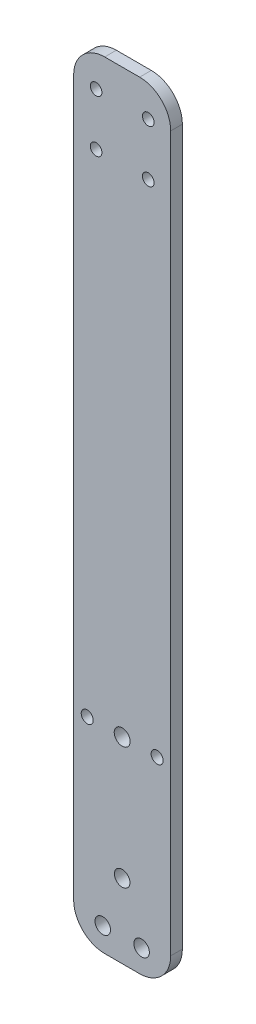
ISO-10303-21;
HEADER;
FILE_DESCRIPTION(('STEP AP214'),'2;1');
FILE_NAME('part.step','',(''),(''),'','','');
FILE_SCHEMA(('AUTOMOTIVE_DESIGN { 1 0 10303 214 1 1 1 1 }'));
ENDSEC;
DATA;
#1=APPLICATION_CONTEXT('core data for automotive mechanical design processes');
#2=APPLICATION_PROTOCOL_DEFINITION('international standard','automotive_design',2000,#1);
#3=PRODUCT_CONTEXT('',#1,'mechanical');
#4=PRODUCT('Part','Part','',(#3));
#5=PRODUCT_RELATED_PRODUCT_CATEGORY('part','',(#4));
#6=PRODUCT_DEFINITION_FORMATION('','',#4);
#7=PRODUCT_DEFINITION_CONTEXT('part definition',#1,'design');
#8=PRODUCT_DEFINITION('design','',#6,#7);
#9=PRODUCT_DEFINITION_SHAPE('','',#8);
#10=(LENGTH_UNIT() NAMED_UNIT(*) SI_UNIT(.MILLI.,.METRE.));
#11=(NAMED_UNIT(*) PLANE_ANGLE_UNIT() SI_UNIT($,.RADIAN.));
#12=(NAMED_UNIT(*) SI_UNIT($,.STERADIAN.) SOLID_ANGLE_UNIT());
#13=UNCERTAINTY_MEASURE_WITH_UNIT(LENGTH_MEASURE(1.E-05),#10,'distance_accuracy_value','');
#14=(GEOMETRIC_REPRESENTATION_CONTEXT(3) GLOBAL_UNCERTAINTY_ASSIGNED_CONTEXT((#13)) GLOBAL_UNIT_ASSIGNED_CONTEXT((#10,
#11,#12)) REPRESENTATION_CONTEXT('',''));
#15=CARTESIAN_POINT('',(0.,0.,0.));
#16=DIRECTION('',(0.,0.,1.));
#17=DIRECTION('',(1.,0.,0.));
#18=AXIS2_PLACEMENT_3D('',#15,#16,#17);
#19=CARTESIAN_POINT('',(0.,0.,3.));
#20=DIRECTION('',(0.,0.,-1.));
#21=DIRECTION('',(-1.,0.,0.));
#22=AXIS2_PLACEMENT_3D('',#19,#20,#21);
#23=PLANE('',#22);
#24=CARTESIAN_POINT('',(21.5,50.5628276457725,3.));
#25=DIRECTION('',(0.,0.,1.));
#26=DIRECTION('',(1.,0.,0.));
#27=AXIS2_PLACEMENT_3D('',#24,#25,#26);
#28=CIRCLE('',#27,1.55);
#29=CARTESIAN_POINT('',(23.05,50.5628276457725,3.));
#30=VERTEX_POINT('',#29);
#31=EDGE_CURVE('E229',#30,#30,#28,.T.);
#32=ORIENTED_EDGE('',*,*,#31,.F.);
#33=EDGE_LOOP('',(#32));
#34=FACE_BOUND('',#33,.T.);
#35=CARTESIAN_POINT('',(3.5,50.5628276457725,3.));
#36=DIRECTION('',(0.,0.,1.));
#37=DIRECTION('',(-1.,0.,0.));
#38=AXIS2_PLACEMENT_3D('',#35,#36,#37);
#39=CIRCLE('',#38,1.55000000000001);
#40=CARTESIAN_POINT('',(5.05000000000001,50.5628276457725,3.));
#41=VERTEX_POINT('',#40);
#42=EDGE_CURVE('E232',#41,#41,#39,.T.);
#43=ORIENTED_EDGE('',*,*,#42,.F.);
#44=EDGE_LOOP('',(#43));
#45=FACE_BOUND('',#44,.T.);
#46=DIRECTION('',(1.,0.,0.));
#47=VECTOR('',#46,1.);
#48=CARTESIAN_POINT('',(0.,0.,3.));
#49=LINE('',#48,#47);
#50=CARTESIAN_POINT('',(8.,0.,3.));
#51=VERTEX_POINT('',#50);
#52=CARTESIAN_POINT('',(17.,0.,3.));
#53=VERTEX_POINT('',#52);
#54=EDGE_CURVE('E174',#51,#53,#49,.T.);
#55=ORIENTED_EDGE('',*,*,#54,.T.);
#56=CARTESIAN_POINT('',(17.,8.,3.));
#57=DIRECTION('',(0.,0.,-1.));
#58=DIRECTION('',(-1.,0.,0.));
#59=AXIS2_PLACEMENT_3D('',#56,#57,#58);
#60=CIRCLE('',#59,8.);
#61=CARTESIAN_POINT('',(25.,8.,3.));
#62=VERTEX_POINT('',#61);
#63=EDGE_CURVE('E152',#53,#62,#60,.F.);
#64=ORIENTED_EDGE('',*,*,#63,.T.);
#65=DIRECTION('',(0.,1.,0.));
#66=VECTOR('',#65,1.);
#67=CARTESIAN_POINT('',(25.,0.,3.));
#68=LINE('',#67,#66);
#69=CARTESIAN_POINT('',(25.,192.,3.));
#70=VERTEX_POINT('',#69);
#71=EDGE_CURVE('E122',#62,#70,#68,.T.);
#72=ORIENTED_EDGE('',*,*,#71,.T.);
#73=CARTESIAN_POINT('',(17.,192.,3.));
#74=DIRECTION('',(0.,0.,-1.));
#75=DIRECTION('',(-1.,0.,0.));
#76=AXIS2_PLACEMENT_3D('',#73,#74,#75);
#77=CIRCLE('',#76,8.);
#78=CARTESIAN_POINT('',(17.,200.,3.));
#79=VERTEX_POINT('',#78);
#80=EDGE_CURVE('E58',#70,#79,#77,.F.);
#81=ORIENTED_EDGE('',*,*,#80,.T.);
#82=DIRECTION('',(-1.,0.,0.));
#83=VECTOR('',#82,1.);
#84=CARTESIAN_POINT('',(0.,200.,3.));
#85=LINE('',#84,#83);
#86=CARTESIAN_POINT('',(8.,200.,3.));
#87=VERTEX_POINT('',#86);
#88=EDGE_CURVE('E138',#79,#87,#85,.T.);
#89=ORIENTED_EDGE('',*,*,#88,.T.);
#90=CARTESIAN_POINT('',(8.,192.,3.));
#91=DIRECTION('',(0.,0.,-1.));
#92=DIRECTION('',(-1.,0.,0.));
#93=AXIS2_PLACEMENT_3D('',#90,#91,#92);
#94=CIRCLE('',#93,8.);
#95=CARTESIAN_POINT('',(0.,192.,3.));
#96=VERTEX_POINT('',#95);
#97=EDGE_CURVE('E148',#87,#96,#94,.F.);
#98=ORIENTED_EDGE('',*,*,#97,.T.);
#99=DIRECTION('',(0.,-1.,0.));
#100=VECTOR('',#99,1.);
#101=CARTESIAN_POINT('',(0.,0.,3.));
#102=LINE('',#101,#100);
#103=CARTESIAN_POINT('',(0.,8.,3.));
#104=VERTEX_POINT('',#103);
#105=EDGE_CURVE('E132',#96,#104,#102,.T.);
#106=ORIENTED_EDGE('',*,*,#105,.T.);
#107=CARTESIAN_POINT('',(8.,8.,3.));
#108=DIRECTION('',(0.,0.,-1.));
#109=DIRECTION('',(-1.,0.,0.));
#110=AXIS2_PLACEMENT_3D('',#107,#108,#109);
#111=CIRCLE('',#110,8.);
#112=EDGE_CURVE('E150',#104,#51,#111,.F.);
#113=ORIENTED_EDGE('',*,*,#112,.T.);
#114=EDGE_LOOP('',(#55,#64,#72,#81,#89,#98,#106,#113));
#115=FACE_BOUND('',#114,.T.);
#116=CARTESIAN_POINT('',(7.5,6.,3.));
#117=DIRECTION('',(0.,0.,1.));
#118=DIRECTION('',(1.,0.,0.));
#119=AXIS2_PLACEMENT_3D('',#116,#117,#118);
#120=CIRCLE('',#119,2.);
#121=CARTESIAN_POINT('',(9.5,6.,3.));
#122=VERTEX_POINT('',#121);
#123=EDGE_CURVE('E183',#122,#122,#120,.T.);
#124=ORIENTED_EDGE('',*,*,#123,.F.);
#125=EDGE_LOOP('',(#124));
#126=FACE_BOUND('',#125,.T.);
#127=CARTESIAN_POINT('',(17.5,6.,3.));
#128=DIRECTION('',(0.,0.,1.));
#129=DIRECTION('',(-1.,0.,0.));
#130=AXIS2_PLACEMENT_3D('',#127,#128,#129);
#131=CIRCLE('',#130,2.);
#132=CARTESIAN_POINT('',(15.5,6.,3.));
#133=VERTEX_POINT('',#132);
#134=EDGE_CURVE('E188',#133,#133,#131,.T.);
#135=ORIENTED_EDGE('',*,*,#134,.F.);
#136=EDGE_LOOP('',(#135));
#137=FACE_BOUND('',#136,.T.);
#138=CARTESIAN_POINT('',(12.5,19.0552824557725,3.));
#139=DIRECTION('',(0.,0.,1.));
#140=DIRECTION('',(1.,0.,0.));
#141=AXIS2_PLACEMENT_3D('',#138,#139,#140);
#142=CIRCLE('',#141,2.);
#143=CARTESIAN_POINT('',(14.5,19.0552824557725,3.));
#144=VERTEX_POINT('',#143);
#145=EDGE_CURVE('E193',#144,#144,#142,.T.);
#146=ORIENTED_EDGE('',*,*,#145,.F.);
#147=EDGE_LOOP('',(#146));
#148=FACE_BOUND('',#147,.T.);
#149=CARTESIAN_POINT('',(5.78248557872782,178.282485578728,3.));
#150=DIRECTION('',(0.,0.,1.));
#151=DIRECTION('',(1.,0.,0.));
#152=AXIS2_PLACEMENT_3D('',#149,#150,#151);
#153=CIRCLE('',#152,1.50000000000003);
#154=CARTESIAN_POINT('',(7.28248557872785,178.282485578728,3.));
#155=VERTEX_POINT('',#154);
#156=EDGE_CURVE('E199',#155,#155,#153,.T.);
#157=ORIENTED_EDGE('',*,*,#156,.F.);
#158=EDGE_LOOP('',(#157));
#159=FACE_BOUND('',#158,.T.);
#160=CARTESIAN_POINT('',(5.78248557872782,191.717514421272,3.));
#161=DIRECTION('',(0.,0.,1.));
#162=DIRECTION('',(1.,0.,0.));
#163=AXIS2_PLACEMENT_3D('',#160,#161,#162);
#164=CIRCLE('',#163,1.5);
#165=CARTESIAN_POINT('',(7.28248557872782,191.717514421272,3.));
#166=VERTEX_POINT('',#165);
#167=EDGE_CURVE('E205',#166,#166,#164,.T.);
#168=ORIENTED_EDGE('',*,*,#167,.F.);
#169=EDGE_LOOP('',(#168));
#170=FACE_BOUND('',#169,.T.);
#171=CARTESIAN_POINT('',(19.2175144212722,191.717514421272,3.));
#172=DIRECTION('',(0.,0.,1.));
#173=DIRECTION('',(1.,0.,0.));
#174=AXIS2_PLACEMENT_3D('',#171,#172,#173);
#175=CIRCLE('',#174,1.5);
#176=CARTESIAN_POINT('',(20.7175144212722,191.717514421272,3.));
#177=VERTEX_POINT('',#176);
#178=EDGE_CURVE('E211',#177,#177,#175,.T.);
#179=ORIENTED_EDGE('',*,*,#178,.F.);
#180=EDGE_LOOP('',(#179));
#181=FACE_BOUND('',#180,.T.);
#182=CARTESIAN_POINT('',(19.2175144212722,178.282485578728,3.));
#183=DIRECTION('',(0.,0.,1.));
#184=DIRECTION('',(1.,0.,0.));
#185=AXIS2_PLACEMENT_3D('',#182,#183,#184);
#186=CIRCLE('',#185,1.50000000000002);
#187=CARTESIAN_POINT('',(20.7175144212722,178.282485578728,3.));
#188=VERTEX_POINT('',#187);
#189=EDGE_CURVE('E217',#188,#188,#186,.T.);
#190=ORIENTED_EDGE('',*,*,#189,.F.);
#191=EDGE_LOOP('',(#190));
#192=FACE_BOUND('',#191,.T.);
#193=CARTESIAN_POINT('',(12.5,50.5628276457725,3.));
#194=DIRECTION('',(0.,0.,1.));
#195=DIRECTION('',(1.,0.,0.));
#196=AXIS2_PLACEMENT_3D('',#193,#194,#195);
#197=CIRCLE('',#196,2.05000000000001);
#198=CARTESIAN_POINT('',(14.55,50.5628276457725,3.));
#199=VERTEX_POINT('',#198);
#200=EDGE_CURVE('E223',#199,#199,#197,.T.);
#201=ORIENTED_EDGE('',*,*,#200,.F.);
#202=EDGE_LOOP('',(#201));
#203=FACE_BOUND('',#202,.T.);
#204=ADVANCED_FACE('F38',(#34,#45,#115,#126,#137,#148,#159,#170,#181,#192,#203),#23,.F.);
#205=CARTESIAN_POINT('',(0.,0.,0.));
#206=DIRECTION('',(0.,0.,-1.));
#207=DIRECTION('',(-1.,0.,0.));
#208=AXIS2_PLACEMENT_3D('',#205,#206,#207);
#209=PLANE('',#208);
#210=CARTESIAN_POINT('',(21.5,50.5628276457725,0.));
#211=DIRECTION('',(0.,0.,-1.));
#212=DIRECTION('',(-1.,0.,0.));
#213=AXIS2_PLACEMENT_3D('',#210,#211,#212);
#214=CIRCLE('',#213,1.55);
#215=CARTESIAN_POINT('',(23.05,50.5628276457725,0.));
#216=VERTEX_POINT('',#215);
#217=EDGE_CURVE('E238',#216,#216,#214,.F.);
#218=ORIENTED_EDGE('',*,*,#217,.T.);
#219=EDGE_LOOP('',(#218));
#220=FACE_BOUND('',#219,.T.);
#221=CARTESIAN_POINT('',(3.5,50.5628276457725,0.));
#222=DIRECTION('',(0.,0.,-1.));
#223=DIRECTION('',(-1.,0.,0.));
#224=AXIS2_PLACEMENT_3D('',#221,#222,#223);
#225=CIRCLE('',#224,1.55000000000001);
#226=CARTESIAN_POINT('',(5.05000000000001,50.5628276457725,0.));
#227=VERTEX_POINT('',#226);
#228=EDGE_CURVE('E235',#227,#227,#225,.F.);
#229=ORIENTED_EDGE('',*,*,#228,.T.);
#230=EDGE_LOOP('',(#229));
#231=FACE_BOUND('',#230,.T.);
#232=CARTESIAN_POINT('',(19.2175144212722,178.282485578728,0.));
#233=DIRECTION('',(0.,0.,1.));
#234=DIRECTION('',(1.,0.,0.));
#235=AXIS2_PLACEMENT_3D('',#232,#233,#234);
#236=CIRCLE('',#235,1.50000000000002);
#237=CARTESIAN_POINT('',(20.7175144212722,178.282485578728,0.));
#238=VERTEX_POINT('',#237);
#239=EDGE_CURVE('E220',#238,#238,#236,.T.);
#240=ORIENTED_EDGE('',*,*,#239,.T.);
#241=EDGE_LOOP('',(#240));
#242=FACE_BOUND('',#241,.T.);
#243=CARTESIAN_POINT('',(5.78248557872782,191.717514421272,0.));
#244=DIRECTION('',(0.,0.,1.));
#245=DIRECTION('',(1.,0.,0.));
#246=AXIS2_PLACEMENT_3D('',#243,#244,#245);
#247=CIRCLE('',#246,1.5);
#248=CARTESIAN_POINT('',(7.28248557872782,191.717514421272,0.));
#249=VERTEX_POINT('',#248);
#250=EDGE_CURVE('E208',#249,#249,#247,.T.);
#251=ORIENTED_EDGE('',*,*,#250,.T.);
#252=EDGE_LOOP('',(#251));
#253=FACE_BOUND('',#252,.T.);
#254=CARTESIAN_POINT('',(12.5,19.0552824557725,0.));
#255=DIRECTION('',(0.,0.,1.));
#256=DIRECTION('',(1.,0.,0.));
#257=AXIS2_PLACEMENT_3D('',#254,#255,#256);
#258=CIRCLE('',#257,2.);
#259=CARTESIAN_POINT('',(14.5,19.0552824557725,0.));
#260=VERTEX_POINT('',#259);
#261=EDGE_CURVE('E196',#260,#260,#258,.T.);
#262=ORIENTED_EDGE('',*,*,#261,.T.);
#263=EDGE_LOOP('',(#262));
#264=FACE_BOUND('',#263,.T.);
#265=CARTESIAN_POINT('',(7.5,6.,0.));
#266=DIRECTION('',(0.,0.,1.));
#267=DIRECTION('',(1.,0.,0.));
#268=AXIS2_PLACEMENT_3D('',#265,#266,#267);
#269=CIRCLE('',#268,2.);
#270=CARTESIAN_POINT('',(9.5,6.,0.));
#271=VERTEX_POINT('',#270);
#272=EDGE_CURVE('E179',#271,#271,#269,.T.);
#273=ORIENTED_EDGE('',*,*,#272,.T.);
#274=EDGE_LOOP('',(#273));
#275=FACE_BOUND('',#274,.T.);
#276=DIRECTION('',(0.,1.,0.));
#277=VECTOR('',#276,1.);
#278=CARTESIAN_POINT('',(25.,0.,0.));
#279=LINE('',#278,#277);
#280=CARTESIAN_POINT('',(25.,8.,0.));
#281=VERTEX_POINT('',#280);
#282=CARTESIAN_POINT('',(25.,192.,0.));
#283=VERTEX_POINT('',#282);
#284=EDGE_CURVE('E120',#281,#283,#279,.T.);
#285=ORIENTED_EDGE('',*,*,#284,.F.);
#286=CARTESIAN_POINT('',(17.,8.,0.));
#287=DIRECTION('',(0.,0.,-1.));
#288=DIRECTION('',(-1.,0.,0.));
#289=AXIS2_PLACEMENT_3D('',#286,#287,#288);
#290=CIRCLE('',#289,8.);
#291=CARTESIAN_POINT('',(17.,0.,0.));
#292=VERTEX_POINT('',#291);
#293=EDGE_CURVE('E103',#281,#292,#290,.T.);
#294=ORIENTED_EDGE('',*,*,#293,.T.);
#295=DIRECTION('',(1.,0.,0.));
#296=VECTOR('',#295,1.);
#297=CARTESIAN_POINT('',(0.,0.,0.));
#298=LINE('',#297,#296);
#299=CARTESIAN_POINT('',(8.,0.,0.));
#300=VERTEX_POINT('',#299);
#301=EDGE_CURVE('E130',#300,#292,#298,.T.);
#302=ORIENTED_EDGE('',*,*,#301,.F.);
#303=CARTESIAN_POINT('',(8.,8.,0.));
#304=DIRECTION('',(0.,0.,-1.));
#305=DIRECTION('',(-1.,0.,0.));
#306=AXIS2_PLACEMENT_3D('',#303,#304,#305);
#307=CIRCLE('',#306,8.);
#308=CARTESIAN_POINT('',(0.,8.,0.));
#309=VERTEX_POINT('',#308);
#310=EDGE_CURVE('E114',#300,#309,#307,.T.);
#311=ORIENTED_EDGE('',*,*,#310,.T.);
#312=DIRECTION('',(0.,-1.,0.));
#313=VECTOR('',#312,1.);
#314=CARTESIAN_POINT('',(0.,0.,0.));
#315=LINE('',#314,#313);
#316=CARTESIAN_POINT('',(0.,192.,0.));
#317=VERTEX_POINT('',#316);
#318=EDGE_CURVE('E134',#317,#309,#315,.T.);
#319=ORIENTED_EDGE('',*,*,#318,.F.);
#320=CARTESIAN_POINT('',(8.,192.,0.));
#321=DIRECTION('',(0.,0.,-1.));
#322=DIRECTION('',(-1.,0.,0.));
#323=AXIS2_PLACEMENT_3D('',#320,#321,#322);
#324=CIRCLE('',#323,8.);
#325=CARTESIAN_POINT('',(8.,200.,0.));
#326=VERTEX_POINT('',#325);
#327=EDGE_CURVE('E141',#317,#326,#324,.T.);
#328=ORIENTED_EDGE('',*,*,#327,.T.);
#329=DIRECTION('',(-1.,0.,0.));
#330=VECTOR('',#329,1.);
#331=CARTESIAN_POINT('',(0.,200.,0.));
#332=LINE('',#331,#330);
#333=CARTESIAN_POINT('',(17.,200.,0.));
#334=VERTEX_POINT('',#333);
#335=EDGE_CURVE('E129',#334,#326,#332,.T.);
#336=ORIENTED_EDGE('',*,*,#335,.F.);
#337=CARTESIAN_POINT('',(17.,192.,0.));
#338=DIRECTION('',(0.,0.,-1.));
#339=DIRECTION('',(-1.,0.,0.));
#340=AXIS2_PLACEMENT_3D('',#337,#338,#339);
#341=CIRCLE('',#340,8.);
#342=EDGE_CURVE('E123',#334,#283,#341,.T.);
#343=ORIENTED_EDGE('',*,*,#342,.T.);
#344=EDGE_LOOP('',(#285,#294,#302,#311,#319,#328,#336,#343));
#345=FACE_BOUND('',#344,.T.);
#346=CARTESIAN_POINT('',(17.5,6.,0.));
#347=DIRECTION('',(0.,0.,1.));
#348=DIRECTION('',(-1.,0.,0.));
#349=AXIS2_PLACEMENT_3D('',#346,#347,#348);
#350=CIRCLE('',#349,2.);
#351=CARTESIAN_POINT('',(15.5,6.,0.));
#352=VERTEX_POINT('',#351);
#353=EDGE_CURVE('E190',#352,#352,#350,.T.);
#354=ORIENTED_EDGE('',*,*,#353,.T.);
#355=EDGE_LOOP('',(#354));
#356=FACE_BOUND('',#355,.T.);
#357=CARTESIAN_POINT('',(5.78248557872782,178.282485578728,0.));
#358=DIRECTION('',(0.,0.,1.));
#359=DIRECTION('',(1.,0.,0.));
#360=AXIS2_PLACEMENT_3D('',#357,#358,#359);
#361=CIRCLE('',#360,1.50000000000003);
#362=CARTESIAN_POINT('',(7.28248557872785,178.282485578728,0.));
#363=VERTEX_POINT('',#362);
#364=EDGE_CURVE('E202',#363,#363,#361,.T.);
#365=ORIENTED_EDGE('',*,*,#364,.T.);
#366=EDGE_LOOP('',(#365));
#367=FACE_BOUND('',#366,.T.);
#368=CARTESIAN_POINT('',(19.2175144212722,191.717514421272,0.));
#369=DIRECTION('',(0.,0.,1.));
#370=DIRECTION('',(1.,0.,0.));
#371=AXIS2_PLACEMENT_3D('',#368,#369,#370);
#372=CIRCLE('',#371,1.5);
#373=CARTESIAN_POINT('',(20.7175144212722,191.717514421272,0.));
#374=VERTEX_POINT('',#373);
#375=EDGE_CURVE('E214',#374,#374,#372,.T.);
#376=ORIENTED_EDGE('',*,*,#375,.T.);
#377=EDGE_LOOP('',(#376));
#378=FACE_BOUND('',#377,.T.);
#379=CARTESIAN_POINT('',(12.5,50.5628276457725,0.));
#380=DIRECTION('',(0.,0.,1.));
#381=DIRECTION('',(1.,0.,0.));
#382=AXIS2_PLACEMENT_3D('',#379,#380,#381);
#383=CIRCLE('',#382,2.05000000000001);
#384=CARTESIAN_POINT('',(14.55,50.5628276457725,0.));
#385=VERTEX_POINT('',#384);
#386=EDGE_CURVE('E226',#385,#385,#383,.T.);
#387=ORIENTED_EDGE('',*,*,#386,.T.);
#388=EDGE_LOOP('',(#387));
#389=FACE_BOUND('',#388,.T.);
#390=ADVANCED_FACE('F126',(#220,#231,#242,#253,#264,#275,#345,#356,#367,#378,#389),#209,.T.);
#391=CARTESIAN_POINT('',(0.,0.,3.));
#392=DIRECTION('',(1.,0.,0.));
#393=DIRECTION('',(0.,0.,-1.));
#394=AXIS2_PLACEMENT_3D('',#391,#392,#393);
#395=PLANE('',#394);
#396=ORIENTED_EDGE('',*,*,#318,.T.);
#397=DIRECTION('',(0.,0.,-1.));
#398=VECTOR('',#397,1.);
#399=CARTESIAN_POINT('',(0.,8.,3.));
#400=LINE('',#399,#398);
#401=EDGE_CURVE('E157',#309,#104,#400,.F.);
#402=ORIENTED_EDGE('',*,*,#401,.T.);
#403=ORIENTED_EDGE('',*,*,#105,.F.);
#404=DIRECTION('',(0.,0.,-1.));
#405=VECTOR('',#404,1.);
#406=CARTESIAN_POINT('',(0.,192.,3.));
#407=LINE('',#406,#405);
#408=EDGE_CURVE('E154',#96,#317,#407,.T.);
#409=ORIENTED_EDGE('',*,*,#408,.T.);
#410=EDGE_LOOP('',(#396,#402,#403,#409));
#411=FACE_BOUND('',#410,.T.);
#412=ADVANCED_FACE('F170',(#411),#395,.F.);
#413=CARTESIAN_POINT('',(0.,0.,3.));
#414=DIRECTION('',(0.,1.,0.));
#415=DIRECTION('',(0.,0.,1.));
#416=AXIS2_PLACEMENT_3D('',#413,#414,#415);
#417=PLANE('',#416);
#418=ORIENTED_EDGE('',*,*,#301,.T.);
#419=DIRECTION('',(0.,0.,-1.));
#420=VECTOR('',#419,1.);
#421=CARTESIAN_POINT('',(17.,0.,3.));
#422=LINE('',#421,#420);
#423=EDGE_CURVE('E108',#292,#53,#422,.F.);
#424=ORIENTED_EDGE('',*,*,#423,.T.);
#425=ORIENTED_EDGE('',*,*,#54,.F.);
#426=DIRECTION('',(0.,0.,-1.));
#427=VECTOR('',#426,1.);
#428=CARTESIAN_POINT('',(8.,0.,3.));
#429=LINE('',#428,#427);
#430=EDGE_CURVE('E113',#51,#300,#429,.T.);
#431=ORIENTED_EDGE('',*,*,#430,.T.);
#432=EDGE_LOOP('',(#418,#424,#425,#431));
#433=FACE_BOUND('',#432,.T.);
#434=ADVANCED_FACE('F281',(#433),#417,.F.);
#435=CARTESIAN_POINT('',(25.,0.,3.));
#436=DIRECTION('',(-1.,0.,0.));
#437=DIRECTION('',(0.,0.,1.));
#438=AXIS2_PLACEMENT_3D('',#435,#436,#437);
#439=PLANE('',#438);
#440=ORIENTED_EDGE('',*,*,#71,.F.);
#441=DIRECTION('',(0.,0.,-1.));
#442=VECTOR('',#441,1.);
#443=CARTESIAN_POINT('',(25.,8.,3.));
#444=LINE('',#443,#442);
#445=EDGE_CURVE('E107',#62,#281,#444,.T.);
#446=ORIENTED_EDGE('',*,*,#445,.T.);
#447=ORIENTED_EDGE('',*,*,#284,.T.);
#448=DIRECTION('',(0.,0.,-1.));
#449=VECTOR('',#448,1.);
#450=CARTESIAN_POINT('',(25.,192.,3.));
#451=LINE('',#450,#449);
#452=EDGE_CURVE('E124',#283,#70,#451,.F.);
#453=ORIENTED_EDGE('',*,*,#452,.T.);
#454=EDGE_LOOP('',(#440,#446,#447,#453));
#455=FACE_BOUND('',#454,.T.);
#456=ADVANCED_FACE('F119',(#455),#439,.F.);
#457=CARTESIAN_POINT('',(0.,200.,3.));
#458=DIRECTION('',(0.,-1.,0.));
#459=DIRECTION('',(0.,0.,-1.));
#460=AXIS2_PLACEMENT_3D('',#457,#458,#459);
#461=PLANE('',#460);
#462=ORIENTED_EDGE('',*,*,#335,.T.);
#463=DIRECTION('',(0.,0.,-1.));
#464=VECTOR('',#463,1.);
#465=CARTESIAN_POINT('',(8.,200.,3.));
#466=LINE('',#465,#464);
#467=EDGE_CURVE('E11',#326,#87,#466,.F.);
#468=ORIENTED_EDGE('',*,*,#467,.T.);
#469=ORIENTED_EDGE('',*,*,#88,.F.);
#470=DIRECTION('',(0.,0.,-1.));
#471=VECTOR('',#470,1.);
#472=CARTESIAN_POINT('',(17.,200.,3.));
#473=LINE('',#472,#471);
#474=EDGE_CURVE('E46',#79,#334,#473,.T.);
#475=ORIENTED_EDGE('',*,*,#474,.T.);
#476=EDGE_LOOP('',(#462,#468,#469,#475));
#477=FACE_BOUND('',#476,.T.);
#478=ADVANCED_FACE('F160',(#477),#461,.F.);
#479=CARTESIAN_POINT('',(7.5,6.,3.));
#480=DIRECTION('',(0.,0.,-1.));
#481=DIRECTION('',(-1.,0.,0.));
#482=AXIS2_PLACEMENT_3D('',#479,#480,#481);
#483=CYLINDRICAL_SURFACE('',#482,2.);
#484=ORIENTED_EDGE('',*,*,#123,.T.);
#485=EDGE_LOOP('',(#484));
#486=FACE_BOUND('',#485,.T.);
#487=ORIENTED_EDGE('',*,*,#272,.F.);
#488=EDGE_LOOP('',(#487));
#489=FACE_BOUND('',#488,.T.);
#490=ADVANCED_FACE('F288',(#486,#489),#483,.F.);
#491=CARTESIAN_POINT('',(17.5,6.,3.));
#492=DIRECTION('',(0.,0.,-1.));
#493=DIRECTION('',(-1.,0.,0.));
#494=AXIS2_PLACEMENT_3D('',#491,#492,#493);
#495=CYLINDRICAL_SURFACE('',#494,2.);
#496=ORIENTED_EDGE('',*,*,#134,.T.);
#497=EDGE_LOOP('',(#496));
#498=FACE_BOUND('',#497,.T.);
#499=ORIENTED_EDGE('',*,*,#353,.F.);
#500=EDGE_LOOP('',(#499));
#501=FACE_BOUND('',#500,.T.);
#502=ADVANCED_FACE('F334',(#498,#501),#495,.F.);
#503=CARTESIAN_POINT('',(12.5,19.0552824557725,3.));
#504=DIRECTION('',(0.,0.,-1.));
#505=DIRECTION('',(-1.,0.,0.));
#506=AXIS2_PLACEMENT_3D('',#503,#504,#505);
#507=CYLINDRICAL_SURFACE('',#506,2.);
#508=ORIENTED_EDGE('',*,*,#145,.T.);
#509=EDGE_LOOP('',(#508));
#510=FACE_BOUND('',#509,.T.);
#511=ORIENTED_EDGE('',*,*,#261,.F.);
#512=EDGE_LOOP('',(#511));
#513=FACE_BOUND('',#512,.T.);
#514=ADVANCED_FACE('F330',(#510,#513),#507,.F.);
#515=CARTESIAN_POINT('',(5.78248557872782,178.282485578728,3.));
#516=DIRECTION('',(0.,0.,-1.));
#517=DIRECTION('',(-1.,0.,0.));
#518=AXIS2_PLACEMENT_3D('',#515,#516,#517);
#519=CYLINDRICAL_SURFACE('',#518,1.50000000000003);
#520=ORIENTED_EDGE('',*,*,#156,.T.);
#521=EDGE_LOOP('',(#520));
#522=FACE_BOUND('',#521,.T.);
#523=ORIENTED_EDGE('',*,*,#364,.F.);
#524=EDGE_LOOP('',(#523));
#525=FACE_BOUND('',#524,.T.);
#526=ADVANCED_FACE('F326',(#522,#525),#519,.F.);
#527=CARTESIAN_POINT('',(5.78248557872782,191.717514421272,3.));
#528=DIRECTION('',(0.,0.,-1.));
#529=DIRECTION('',(-1.,0.,0.));
#530=AXIS2_PLACEMENT_3D('',#527,#528,#529);
#531=CYLINDRICAL_SURFACE('',#530,1.5);
#532=ORIENTED_EDGE('',*,*,#167,.T.);
#533=EDGE_LOOP('',(#532));
#534=FACE_BOUND('',#533,.T.);
#535=ORIENTED_EDGE('',*,*,#250,.F.);
#536=EDGE_LOOP('',(#535));
#537=FACE_BOUND('',#536,.T.);
#538=ADVANCED_FACE('F322',(#534,#537),#531,.F.);
#539=CARTESIAN_POINT('',(19.2175144212722,191.717514421272,3.));
#540=DIRECTION('',(0.,0.,-1.));
#541=DIRECTION('',(-1.,0.,0.));
#542=AXIS2_PLACEMENT_3D('',#539,#540,#541);
#543=CYLINDRICAL_SURFACE('',#542,1.5);
#544=ORIENTED_EDGE('',*,*,#178,.T.);
#545=EDGE_LOOP('',(#544));
#546=FACE_BOUND('',#545,.T.);
#547=ORIENTED_EDGE('',*,*,#375,.F.);
#548=EDGE_LOOP('',(#547));
#549=FACE_BOUND('',#548,.T.);
#550=ADVANCED_FACE('F318',(#546,#549),#543,.F.);
#551=CARTESIAN_POINT('',(19.2175144212722,178.282485578728,3.));
#552=DIRECTION('',(0.,0.,-1.));
#553=DIRECTION('',(-1.,0.,0.));
#554=AXIS2_PLACEMENT_3D('',#551,#552,#553);
#555=CYLINDRICAL_SURFACE('',#554,1.50000000000002);
#556=ORIENTED_EDGE('',*,*,#189,.T.);
#557=EDGE_LOOP('',(#556));
#558=FACE_BOUND('',#557,.T.);
#559=ORIENTED_EDGE('',*,*,#239,.F.);
#560=EDGE_LOOP('',(#559));
#561=FACE_BOUND('',#560,.T.);
#562=ADVANCED_FACE('F270',(#558,#561),#555,.F.);
#563=CARTESIAN_POINT('',(12.5,50.5628276457725,3.));
#564=DIRECTION('',(0.,0.,-1.));
#565=DIRECTION('',(-1.,0.,0.));
#566=AXIS2_PLACEMENT_3D('',#563,#564,#565);
#567=CYLINDRICAL_SURFACE('',#566,2.05000000000001);
#568=ORIENTED_EDGE('',*,*,#200,.T.);
#569=EDGE_LOOP('',(#568));
#570=FACE_BOUND('',#569,.T.);
#571=ORIENTED_EDGE('',*,*,#386,.F.);
#572=EDGE_LOOP('',(#571));
#573=FACE_BOUND('',#572,.T.);
#574=ADVANCED_FACE('F267',(#570,#573),#567,.F.);
#575=CARTESIAN_POINT('',(17.,8.,3.));
#576=DIRECTION('',(0.,0.,-1.));
#577=DIRECTION('',(-1.,0.,0.));
#578=AXIS2_PLACEMENT_3D('',#575,#576,#577);
#579=CYLINDRICAL_SURFACE('',#578,8.);
#580=ORIENTED_EDGE('',*,*,#63,.F.);
#581=ORIENTED_EDGE('',*,*,#423,.F.);
#582=ORIENTED_EDGE('',*,*,#293,.F.);
#583=ORIENTED_EDGE('',*,*,#445,.F.);
#584=EDGE_LOOP('',(#580,#581,#582,#583));
#585=FACE_BOUND('',#584,.T.);
#586=ADVANCED_FACE('F106',(#585),#579,.T.);
#587=CARTESIAN_POINT('',(8.,8.,3.));
#588=DIRECTION('',(0.,0.,-1.));
#589=DIRECTION('',(-1.,0.,0.));
#590=AXIS2_PLACEMENT_3D('',#587,#588,#589);
#591=CYLINDRICAL_SURFACE('',#590,8.);
#592=ORIENTED_EDGE('',*,*,#112,.F.);
#593=ORIENTED_EDGE('',*,*,#401,.F.);
#594=ORIENTED_EDGE('',*,*,#310,.F.);
#595=ORIENTED_EDGE('',*,*,#430,.F.);
#596=EDGE_LOOP('',(#592,#593,#594,#595));
#597=FACE_BOUND('',#596,.T.);
#598=ADVANCED_FACE('F296',(#597),#591,.T.);
#599=CARTESIAN_POINT('',(8.,192.,3.));
#600=DIRECTION('',(0.,0.,-1.));
#601=DIRECTION('',(-1.,0.,0.));
#602=AXIS2_PLACEMENT_3D('',#599,#600,#601);
#603=CYLINDRICAL_SURFACE('',#602,8.);
#604=ORIENTED_EDGE('',*,*,#97,.F.);
#605=ORIENTED_EDGE('',*,*,#467,.F.);
#606=ORIENTED_EDGE('',*,*,#327,.F.);
#607=ORIENTED_EDGE('',*,*,#408,.F.);
#608=EDGE_LOOP('',(#604,#605,#606,#607));
#609=FACE_BOUND('',#608,.T.);
#610=ADVANCED_FACE('F167',(#609),#603,.T.);
#611=CARTESIAN_POINT('',(17.,192.,3.));
#612=DIRECTION('',(0.,0.,-1.));
#613=DIRECTION('',(-1.,0.,0.));
#614=AXIS2_PLACEMENT_3D('',#611,#612,#613);
#615=CYLINDRICAL_SURFACE('',#614,8.);
#616=ORIENTED_EDGE('',*,*,#80,.F.);
#617=ORIENTED_EDGE('',*,*,#452,.F.);
#618=ORIENTED_EDGE('',*,*,#342,.F.);
#619=ORIENTED_EDGE('',*,*,#474,.F.);
#620=EDGE_LOOP('',(#616,#617,#618,#619));
#621=FACE_BOUND('',#620,.T.);
#622=ADVANCED_FACE('F40',(#621),#615,.T.);
#623=CARTESIAN_POINT('',(3.5,50.5628276457725,-0.00100000000000013));
#624=DIRECTION('',(0.,0.,1.));
#625=DIRECTION('',(1.,0.,0.));
#626=AXIS2_PLACEMENT_3D('',#623,#624,#625);
#627=CYLINDRICAL_SURFACE('',#626,1.55000000000001);
#628=CARTESIAN_POINT('',(5.05000000000001,50.5628276457725,0.));
#629=CARTESIAN_POINT('',(5.05000000000001,50.5628276457725,0.03125));
#630=CARTESIAN_POINT('',(5.05000000000001,50.5628276457725,0.0625));
#631=CARTESIAN_POINT('',(5.05000000000001,50.5628276457725,0.125));
#632=CARTESIAN_POINT('',(5.05000000000001,50.5628276457725,0.15625));
#633=CARTESIAN_POINT('',(5.05000000000001,50.5628276457725,0.21875));
#634=CARTESIAN_POINT('',(5.05000000000001,50.5628276457725,0.25));
#635=CARTESIAN_POINT('',(5.05000000000001,50.5628276457725,0.3125));
#636=CARTESIAN_POINT('',(5.05000000000001,50.5628276457725,0.34375));
#637=CARTESIAN_POINT('',(5.05000000000001,50.5628276457725,0.40625));
#638=CARTESIAN_POINT('',(5.05000000000001,50.5628276457725,0.4375));
#639=CARTESIAN_POINT('',(5.05000000000001,50.5628276457725,0.5));
#640=CARTESIAN_POINT('',(5.05000000000001,50.5628276457725,0.53125));
#641=CARTESIAN_POINT('',(5.05000000000001,50.5628276457725,0.59375));
#642=CARTESIAN_POINT('',(5.05000000000001,50.5628276457725,0.625));
#643=CARTESIAN_POINT('',(5.05000000000001,50.5628276457725,0.6875));
#644=CARTESIAN_POINT('',(5.05000000000001,50.5628276457725,0.71875));
#645=CARTESIAN_POINT('',(5.05000000000001,50.5628276457725,0.78125));
#646=CARTESIAN_POINT('',(5.05000000000001,50.5628276457725,0.8125));
#647=CARTESIAN_POINT('',(5.05000000000001,50.5628276457725,0.875));
#648=CARTESIAN_POINT('',(5.05000000000001,50.5628276457725,0.90625));
#649=CARTESIAN_POINT('',(5.05000000000001,50.5628276457725,0.96875));
#650=CARTESIAN_POINT('',(5.05000000000001,50.5628276457725,1.));
#651=CARTESIAN_POINT('',(5.05000000000001,50.5628276457725,1.0625));
#652=CARTESIAN_POINT('',(5.05000000000001,50.5628276457725,1.09375));
#653=CARTESIAN_POINT('',(5.05000000000001,50.5628276457725,1.15625));
#654=CARTESIAN_POINT('',(5.05000000000001,50.5628276457725,1.1875));
#655=CARTESIAN_POINT('',(5.05000000000001,50.5628276457725,1.25));
#656=CARTESIAN_POINT('',(5.05000000000001,50.5628276457725,1.28125));
#657=CARTESIAN_POINT('',(5.05000000000001,50.5628276457725,1.34375));
#658=CARTESIAN_POINT('',(5.05000000000001,50.5628276457725,1.375));
#659=CARTESIAN_POINT('',(5.05000000000001,50.5628276457725,1.4375));
#660=CARTESIAN_POINT('',(5.05000000000001,50.5628276457725,1.46875));
#661=CARTESIAN_POINT('',(5.05000000000001,50.5628276457725,1.53125));
#662=CARTESIAN_POINT('',(5.05000000000001,50.5628276457725,1.5625));
#663=CARTESIAN_POINT('',(5.05000000000001,50.5628276457725,1.625));
#664=CARTESIAN_POINT('',(5.05000000000001,50.5628276457725,1.65625));
#665=CARTESIAN_POINT('',(5.05000000000001,50.5628276457725,1.71875));
#666=CARTESIAN_POINT('',(5.05000000000001,50.5628276457725,1.75));
#667=CARTESIAN_POINT('',(5.05000000000001,50.5628276457725,1.8125));
#668=CARTESIAN_POINT('',(5.05000000000001,50.5628276457725,1.84375));
#669=CARTESIAN_POINT('',(5.05000000000001,50.5628276457725,1.90625));
#670=CARTESIAN_POINT('',(5.05000000000001,50.5628276457725,1.9375));
#671=CARTESIAN_POINT('',(5.05000000000001,50.5628276457725,2.));
#672=CARTESIAN_POINT('',(5.05000000000001,50.5628276457725,2.03125));
#673=CARTESIAN_POINT('',(5.05000000000001,50.5628276457725,2.09375));
#674=CARTESIAN_POINT('',(5.05000000000001,50.5628276457725,2.125));
#675=CARTESIAN_POINT('',(5.05000000000001,50.5628276457725,2.1875));
#676=CARTESIAN_POINT('',(5.05000000000001,50.5628276457725,2.21875));
#677=CARTESIAN_POINT('',(5.05000000000001,50.5628276457725,2.28125));
#678=CARTESIAN_POINT('',(5.05000000000001,50.5628276457725,2.3125));
#679=CARTESIAN_POINT('',(5.05000000000001,50.5628276457725,2.375));
#680=CARTESIAN_POINT('',(5.05000000000001,50.5628276457725,2.40625));
#681=CARTESIAN_POINT('',(5.05000000000001,50.5628276457725,2.46875));
#682=CARTESIAN_POINT('',(5.05000000000001,50.5628276457725,2.5));
#683=CARTESIAN_POINT('',(5.05000000000001,50.5628276457725,2.5625));
#684=CARTESIAN_POINT('',(5.05000000000001,50.5628276457725,2.59375));
#685=CARTESIAN_POINT('',(5.05000000000001,50.5628276457725,2.65625));
#686=CARTESIAN_POINT('',(5.05000000000001,50.5628276457725,2.6875));
#687=CARTESIAN_POINT('',(5.05000000000001,50.5628276457725,2.75));
#688=CARTESIAN_POINT('',(5.05000000000001,50.5628276457725,2.78125));
#689=CARTESIAN_POINT('',(5.05000000000001,50.5628276457725,2.84375));
#690=CARTESIAN_POINT('',(5.05000000000001,50.5628276457725,2.875));
#691=CARTESIAN_POINT('',(5.05000000000001,50.5628276457725,2.9375));
#692=CARTESIAN_POINT('',(5.05000000000001,50.5628276457725,2.96875));
#693=CARTESIAN_POINT('',(5.05000000000001,50.5628276457725,3.));
#694=B_SPLINE_CURVE_WITH_KNOTS('',3,(#628,#629,#630,#631,#632,#633,#634,#635,#636,#637,#638,
#639,#640,#641,#642,#643,#644,#645,#646,#647,#648,#649,#650,#651,#652,#653,#654,#655,#656,#657,
#658,#659,#660,#661,#662,#663,#664,#665,#666,#667,#668,#669,#670,#671,#672,#673,#674,#675,#676,
#677,#678,#679,#680,#681,#682,#683,#684,#685,#686,#687,#688,#689,#690,#691,#692,#693),
.UNSPECIFIED.,.F.,.F.,(4,2,2,2,2,2,2,2,2,2,2,2,2,2,2,2,2,2,2,2,2,2,2,2,2,2,2,2,2,2,2,2,4),(0.,
0.09375,0.1875,0.28125,0.375,0.46875,0.5625,0.65625,0.75,0.84375,0.9375,1.03125,1.125,1.21875,
1.3125,1.40625,1.5,1.59375,1.6875,1.78125,1.875,1.96875,2.0625,2.15625,2.25,2.34375,2.4375,
2.53125,2.625,2.71875,2.8125,2.90625,3.),.UNSPECIFIED.);
#695=EDGE_CURVE('BSEAM303',#227,#41,#694,.T.);
#696=ORIENTED_EDGE('',*,*,#228,.F.);
#697=ORIENTED_EDGE('',*,*,#42,.T.);
#698=ORIENTED_EDGE('',*,*,#695,.T.);
#699=ORIENTED_EDGE('',*,*,#695,.F.);
#700=EDGE_LOOP('',(#696,#698,#697,#699));
#701=FACE_BOUND('',#700,.T.);
#702=ADVANCED_FACE('F303',(#701),#627,.F.);
#703=CARTESIAN_POINT('',(21.5,50.5628276457725,-0.00100000000000013));
#704=DIRECTION('',(0.,0.,1.));
#705=DIRECTION('',(1.,0.,0.));
#706=AXIS2_PLACEMENT_3D('',#703,#704,#705);
#707=CYLINDRICAL_SURFACE('',#706,1.55);
#708=CARTESIAN_POINT('',(23.05,50.5628276457725,0.));
#709=CARTESIAN_POINT('',(23.05,50.5628276457725,0.03125));
#710=CARTESIAN_POINT('',(23.05,50.5628276457725,0.0625));
#711=CARTESIAN_POINT('',(23.05,50.5628276457725,0.125));
#712=CARTESIAN_POINT('',(23.05,50.5628276457725,0.15625));
#713=CARTESIAN_POINT('',(23.05,50.5628276457725,0.21875));
#714=CARTESIAN_POINT('',(23.05,50.5628276457725,0.25));
#715=CARTESIAN_POINT('',(23.05,50.5628276457725,0.3125));
#716=CARTESIAN_POINT('',(23.05,50.5628276457725,0.34375));
#717=CARTESIAN_POINT('',(23.05,50.5628276457725,0.40625));
#718=CARTESIAN_POINT('',(23.05,50.5628276457725,0.4375));
#719=CARTESIAN_POINT('',(23.05,50.5628276457725,0.5));
#720=CARTESIAN_POINT('',(23.05,50.5628276457725,0.53125));
#721=CARTESIAN_POINT('',(23.05,50.5628276457725,0.59375));
#722=CARTESIAN_POINT('',(23.05,50.5628276457725,0.625));
#723=CARTESIAN_POINT('',(23.05,50.5628276457725,0.6875));
#724=CARTESIAN_POINT('',(23.05,50.5628276457725,0.71875));
#725=CARTESIAN_POINT('',(23.05,50.5628276457725,0.78125));
#726=CARTESIAN_POINT('',(23.05,50.5628276457725,0.8125));
#727=CARTESIAN_POINT('',(23.05,50.5628276457725,0.875));
#728=CARTESIAN_POINT('',(23.05,50.5628276457725,0.90625));
#729=CARTESIAN_POINT('',(23.05,50.5628276457725,0.96875));
#730=CARTESIAN_POINT('',(23.05,50.5628276457725,1.));
#731=CARTESIAN_POINT('',(23.05,50.5628276457725,1.0625));
#732=CARTESIAN_POINT('',(23.05,50.5628276457725,1.09375));
#733=CARTESIAN_POINT('',(23.05,50.5628276457725,1.15625));
#734=CARTESIAN_POINT('',(23.05,50.5628276457725,1.1875));
#735=CARTESIAN_POINT('',(23.05,50.5628276457725,1.25));
#736=CARTESIAN_POINT('',(23.05,50.5628276457725,1.28125));
#737=CARTESIAN_POINT('',(23.05,50.5628276457725,1.34375));
#738=CARTESIAN_POINT('',(23.05,50.5628276457725,1.375));
#739=CARTESIAN_POINT('',(23.05,50.5628276457725,1.4375));
#740=CARTESIAN_POINT('',(23.05,50.5628276457725,1.46875));
#741=CARTESIAN_POINT('',(23.05,50.5628276457725,1.53125));
#742=CARTESIAN_POINT('',(23.05,50.5628276457725,1.5625));
#743=CARTESIAN_POINT('',(23.05,50.5628276457725,1.625));
#744=CARTESIAN_POINT('',(23.05,50.5628276457725,1.65625));
#745=CARTESIAN_POINT('',(23.05,50.5628276457725,1.71875));
#746=CARTESIAN_POINT('',(23.05,50.5628276457725,1.75));
#747=CARTESIAN_POINT('',(23.05,50.5628276457725,1.8125));
#748=CARTESIAN_POINT('',(23.05,50.5628276457725,1.84375));
#749=CARTESIAN_POINT('',(23.05,50.5628276457725,1.90625));
#750=CARTESIAN_POINT('',(23.05,50.5628276457725,1.9375));
#751=CARTESIAN_POINT('',(23.05,50.5628276457725,2.));
#752=CARTESIAN_POINT('',(23.05,50.5628276457725,2.03125));
#753=CARTESIAN_POINT('',(23.05,50.5628276457725,2.09375));
#754=CARTESIAN_POINT('',(23.05,50.5628276457725,2.125));
#755=CARTESIAN_POINT('',(23.05,50.5628276457725,2.1875));
#756=CARTESIAN_POINT('',(23.05,50.5628276457725,2.21875));
#757=CARTESIAN_POINT('',(23.05,50.5628276457725,2.28125));
#758=CARTESIAN_POINT('',(23.05,50.5628276457725,2.3125));
#759=CARTESIAN_POINT('',(23.05,50.5628276457725,2.375));
#760=CARTESIAN_POINT('',(23.05,50.5628276457725,2.40625));
#761=CARTESIAN_POINT('',(23.05,50.5628276457725,2.46875));
#762=CARTESIAN_POINT('',(23.05,50.5628276457725,2.5));
#763=CARTESIAN_POINT('',(23.05,50.5628276457725,2.5625));
#764=CARTESIAN_POINT('',(23.05,50.5628276457725,2.59375));
#765=CARTESIAN_POINT('',(23.05,50.5628276457725,2.65625));
#766=CARTESIAN_POINT('',(23.05,50.5628276457725,2.6875));
#767=CARTESIAN_POINT('',(23.05,50.5628276457725,2.75));
#768=CARTESIAN_POINT('',(23.05,50.5628276457725,2.78125));
#769=CARTESIAN_POINT('',(23.05,50.5628276457725,2.84375));
#770=CARTESIAN_POINT('',(23.05,50.5628276457725,2.875));
#771=CARTESIAN_POINT('',(23.05,50.5628276457725,2.9375));
#772=CARTESIAN_POINT('',(23.05,50.5628276457725,2.96875));
#773=CARTESIAN_POINT('',(23.05,50.5628276457725,3.));
#774=B_SPLINE_CURVE_WITH_KNOTS('',3,(#708,#709,#710,#711,#712,#713,#714,#715,#716,#717,#718,
#719,#720,#721,#722,#723,#724,#725,#726,#727,#728,#729,#730,#731,#732,#733,#734,#735,#736,#737,
#738,#739,#740,#741,#742,#743,#744,#745,#746,#747,#748,#749,#750,#751,#752,#753,#754,#755,#756,
#757,#758,#759,#760,#761,#762,#763,#764,#765,#766,#767,#768,#769,#770,#771,#772,#773),
.UNSPECIFIED.,.F.,.F.,(4,2,2,2,2,2,2,2,2,2,2,2,2,2,2,2,2,2,2,2,2,2,2,2,2,2,2,2,2,2,2,2,4),(0.,
0.09375,0.1875,0.28125,0.375,0.46875,0.5625,0.65625,0.75,0.84375,0.9375,1.03125,1.125,1.21875,
1.3125,1.40625,1.5,1.59375,1.6875,1.78125,1.875,1.96875,2.0625,2.15625,2.25,2.34375,2.4375,
2.53125,2.625,2.71875,2.8125,2.90625,3.),.UNSPECIFIED.);
#775=EDGE_CURVE('BSEAM244',#216,#30,#774,.T.);
#776=ORIENTED_EDGE('',*,*,#217,.F.);
#777=ORIENTED_EDGE('',*,*,#31,.T.);
#778=ORIENTED_EDGE('',*,*,#775,.T.);
#779=ORIENTED_EDGE('',*,*,#775,.F.);
#780=EDGE_LOOP('',(#776,#778,#777,#779));
#781=FACE_BOUND('',#780,.T.);
#782=ADVANCED_FACE('F244',(#781),#707,.F.);
#783=CLOSED_SHELL('',(#204,#390,#412,#434,#456,#478,#490,#502,#514,#526,#538,#550,#562,#574,
#586,#598,#610,#622,#702,#782));
#784=MANIFOLD_SOLID_BREP('B2',#783);
#785=ADVANCED_BREP_SHAPE_REPRESENTATION('',(#18,#784),#14);
#786=SHAPE_DEFINITION_REPRESENTATION(#9,#785);
ENDSEC;
END-ISO-10303-21;
